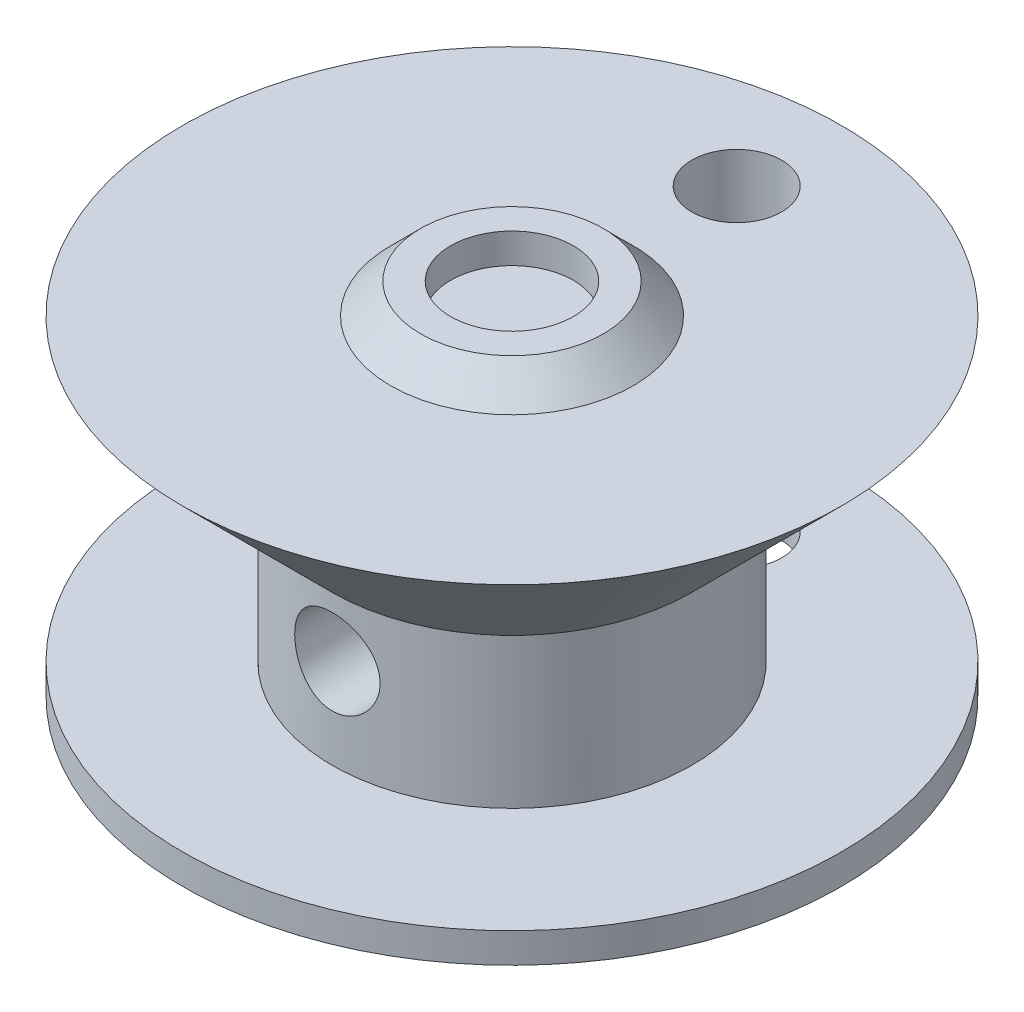
ISO-10303-21;
HEADER;
FILE_DESCRIPTION(('STEP AP214'),'2;1');
FILE_NAME('part.step','',(''),(''),'','','');
FILE_SCHEMA(('AUTOMOTIVE_DESIGN { 1 0 10303 214 1 1 1 1 }'));
ENDSEC;
DATA;
#1=APPLICATION_CONTEXT('core data for automotive mechanical design processes');
#2=APPLICATION_PROTOCOL_DEFINITION('international standard','automotive_design',2000,#1);
#3=PRODUCT_CONTEXT('',#1,'mechanical');
#4=PRODUCT('Part','Part','',(#3));
#5=PRODUCT_RELATED_PRODUCT_CATEGORY('part','',(#4));
#6=PRODUCT_DEFINITION_FORMATION('','',#4);
#7=PRODUCT_DEFINITION_CONTEXT('part definition',#1,'design');
#8=PRODUCT_DEFINITION('design','',#6,#7);
#9=PRODUCT_DEFINITION_SHAPE('','',#8);
#10=(LENGTH_UNIT() NAMED_UNIT(*) SI_UNIT(.MILLI.,.METRE.));
#11=(NAMED_UNIT(*) PLANE_ANGLE_UNIT() SI_UNIT($,.RADIAN.));
#12=(NAMED_UNIT(*) SI_UNIT($,.STERADIAN.) SOLID_ANGLE_UNIT());
#13=UNCERTAINTY_MEASURE_WITH_UNIT(LENGTH_MEASURE(1.E-05),#10,'distance_accuracy_value','');
#14=(GEOMETRIC_REPRESENTATION_CONTEXT(3) GLOBAL_UNCERTAINTY_ASSIGNED_CONTEXT((#13)) GLOBAL_UNIT_ASSIGNED_CONTEXT((#10,
#11,#12)) REPRESENTATION_CONTEXT('',''));
#15=CARTESIAN_POINT('',(0.,0.,0.));
#16=DIRECTION('',(0.,0.,1.));
#17=DIRECTION('',(1.,0.,0.));
#18=AXIS2_PLACEMENT_3D('',#15,#16,#17);
#19=CARTESIAN_POINT('',(0.,-6.,-7.5));
#20=DIRECTION('',(0.,1.,0.));
#21=DIRECTION('',(0.,0.,1.));
#22=AXIS2_PLACEMENT_3D('',#19,#20,#21);
#23=CYLINDRICAL_SURFACE('',#22,1.5);
#24=CARTESIAN_POINT('',(-1.26870488081761,2.39664434459369,-8.30024241663984));
#25=CARTESIAN_POINT('',(-1.32275027709685,2.32010996980889,-8.21456014107574));
#26=CARTESIAN_POINT('',(-1.36661427123205,2.23977946235469,-8.12580957644183));
#27=CARTESIAN_POINT('',(-1.43556861508778,2.07402530976454,-7.94553128783668));
#28=CARTESIAN_POINT('',(-1.46059999942973,1.98858656453833,-7.85399576719215));
#29=CARTESIAN_POINT('',(-1.4942810386583,1.80861159078597,-7.66438540690111));
#30=CARTESIAN_POINT('',(-1.50167214520486,1.71385565336773,-7.56629794717566));
#31=CARTESIAN_POINT('',(-1.49769646010133,1.52273200649526,-7.3721555025522));
#32=CARTESIAN_POINT('',(-1.48632198870708,1.42636365314342,-7.27610136607951));
#33=CARTESIAN_POINT('',(-1.44136326275431,1.21433888128269,-7.06889285227441));
#34=CARTESIAN_POINT('',(-1.40379527360432,1.09867605065692,-6.95855631309214));
#35=CARTESIAN_POINT('',(-1.32777047678987,0.928079019111489,-6.79966708387336));
#36=CARTESIAN_POINT('',(-1.29914550908919,0.871689688668904,-6.74780083952307));
#37=CARTESIAN_POINT('',(-1.23509860279238,0.760449514609011,-6.64670646867279));
#38=CARTESIAN_POINT('',(-1.19968071728378,0.705597775823251,-6.59747679132385));
#39=CARTESIAN_POINT('',(-1.11314269170065,0.586396158386071,-6.49175541165681));
#40=CARTESIAN_POINT('',(-1.06028236538606,0.522602721524751,-6.4360401296291));
#41=CARTESIAN_POINT('',(-0.943097883099596,0.400585750642469,-6.3309198778082));
#42=CARTESIAN_POINT('',(-0.878793020079255,0.342353092367533,-6.28150452468661));
#43=CARTESIAN_POINT('',(-0.756500471273981,0.249061398963522,-6.20327962694322));
#44=CARTESIAN_POINT('',(-0.701365247613399,0.21195371302962,-6.17248189479857));
#45=CARTESIAN_POINT('',(-0.584257625424888,0.14454205744799,-6.11695102903519));
#46=CARTESIAN_POINT('',(-0.522295903408611,0.114227682326576,-6.09220861491444));
#47=CARTESIAN_POINT('',(-0.406177715874168,0.06845167262171,-6.05504634401468));
#48=CARTESIAN_POINT('',(-0.353219440265775,0.0511968245781562,-6.0411197832836));
#49=CARTESIAN_POINT('',(-0.244353603841998,0.023716775961572,-6.01899816561024));
#50=CARTESIAN_POINT('',(-0.188448958504837,0.0134847617639953,-6.01079755316085));
#51=CARTESIAN_POINT('',(-0.0748651752631133,0.000979092118055976,-6.00078050222282));
#52=CARTESIAN_POINT('',(-0.0171782724982473,-0.00125257022391238,-5.99899775028552));
#53=CARTESIAN_POINT('',(0.0977377785373772,0.00260478651116861,-6.00208408371304));
#54=CARTESIAN_POINT('',(0.154966861760674,0.00869496756273081,-6.00695409799999));
#55=CARTESIAN_POINT('',(0.26289956448138,0.0278017441553649,-6.02228762699205));
#56=CARTESIAN_POINT('',(0.313769997322337,0.0402620240704971,-6.03230215641292));
#57=CARTESIAN_POINT('',(0.412591119335263,0.0708006987864238,-6.05695918614998));
#58=CARTESIAN_POINT('',(0.460540538205375,0.08888151730162,-6.07160368306852));
#59=CARTESIAN_POINT('',(0.576183603502632,0.139841139847716,-6.11311502864666));
#60=CARTESIAN_POINT('',(0.641730480997538,0.175595046870602,-6.14242920835007));
#61=CARTESIAN_POINT('',(0.764696200336752,0.254329872416753,-6.20767190625326));
#62=CARTESIAN_POINT('',(0.822093248199737,0.297329520653736,-6.24361758984829));
#63=CARTESIAN_POINT('',(0.955239472676362,0.410500989413759,-6.33933204884527));
#64=CARTESIAN_POINT('',(1.02622908443822,0.483674370238583,-6.40215227306974));
#65=CARTESIAN_POINT('',(1.15248143214062,0.636157472557447,-6.53551397281261));
#66=CARTESIAN_POINT('',(1.20771609827644,0.715477830113603,-6.60606892321954));
#67=CARTESIAN_POINT('',(1.32066703459271,0.906218200688929,-6.77892475952415));
#68=CARTESIAN_POINT('',(1.372338368965,1.01906030687446,-6.88362122892944));
#69=CARTESIAN_POINT('',(1.45028301900606,1.24669745037886,-7.10010691361249));
#70=CARTESIAN_POINT('',(1.47653225675623,1.36149423453782,-7.21190274632635));
#71=CARTESIAN_POINT('',(1.50329724119972,1.59113078264449,-7.44079704281348));
#72=CARTESIAN_POINT('',(1.50355618496891,1.70595976594491,-7.55793698295949));
#73=CARTESIAN_POINT('',(1.47585473872373,1.93137178768559,-7.79293428458994));
#74=CARTESIAN_POINT('',(1.44794113029228,2.04196154950744,-7.9107901347864));
#75=CARTESIAN_POINT('',(1.37398292405552,2.22354892317547,-8.10807229801832));
#76=CARTESIAN_POINT('',(1.33573647582947,2.29658704262582,-8.1885606141519));
#77=CARTESIAN_POINT('',(1.24267891629587,2.43680728048154,-8.34498890265466));
#78=CARTESIAN_POINT('',(1.18789118773595,2.50399749387767,-8.42093511534804));
#79=CARTESIAN_POINT('',(1.0749244800556,2.61599719997671,-8.54886595865352));
#80=CARTESIAN_POINT('',(1.02018847703524,2.6624665025473,-8.60243065473446));
#81=CARTESIAN_POINT('',(0.900006044458406,2.7487046523251,-8.70253204434571));
#82=CARTESIAN_POINT('',(0.834572677964978,2.78848155320884,-8.74907717816343));
#83=CARTESIAN_POINT('',(0.706264628113124,2.85304045247604,-8.82503151356365));
#84=CARTESIAN_POINT('',(0.645037687925225,2.87923237122943,-8.85601689345599));
#85=CARTESIAN_POINT('',(0.516687085002821,2.92464488396731,-8.90991795054105));
#86=CARTESIAN_POINT('',(0.449566313374306,2.94386887246678,-8.93283755691817));
#87=CARTESIAN_POINT('',(0.310589727379187,2.97435897068271,-8.96925874250693));
#88=CARTESIAN_POINT('',(0.238707761110163,2.98557631157473,-8.98270259842404));
#89=CARTESIAN_POINT('',(0.0929264122279981,2.99909503895603,-8.99891085464588));
#90=CARTESIAN_POINT('',(0.0190279881612743,3.00140058989523,-9.00168024309219));
#91=CARTESIAN_POINT('',(-0.120436862446868,2.99717846191059,-8.99661465715342));
#92=CARTESIAN_POINT('',(-0.186073694250371,2.99154073003509,-8.98984805460496));
#93=CARTESIAN_POINT('',(-0.314933280986465,2.97331621794359,-8.968021450791));
#94=CARTESIAN_POINT('',(-0.378156286918461,2.96073016235814,-8.95296231434219));
#95=CARTESIAN_POINT('',(-0.501202552691298,2.92912231987033,-8.91526508112846));
#96=CARTESIAN_POINT('',(-0.5609917860548,2.91004596042124,-8.89256273532595));
#97=CARTESIAN_POINT('',(-0.675543082484826,2.86632287250873,-8.84074689416931));
#98=CARTESIAN_POINT('',(-0.730301092470028,2.84167170744244,-8.81162829303646));
#99=CARTESIAN_POINT('',(-0.854113962432759,2.77728270448439,-8.73595339437538));
#100=CARTESIAN_POINT('',(-0.920583037277607,2.73538673742685,-8.6869949785194));
#101=CARTESIAN_POINT('',(-1.04205317521811,2.64471695153169,-8.58193849640474));
#102=CARTESIAN_POINT('',(-1.09704935890166,2.59594022103301,-8.52583740864048));
#103=CARTESIAN_POINT('',(-1.19187910226939,2.49729512770011,-8.41345191717882));
#104=CARTESIAN_POINT('',(-1.23256794247262,2.44781832375337,-8.35753305233655));
#105=CARTESIAN_POINT('',(-1.26870488081761,2.39664434459369,-8.30024241663984));
#106=B_SPLINE_CURVE_WITH_KNOTS('',3,(#24,#25,#26,#27,#28,#29,#30,#31,#32,#33,#34,#35,#36,#37,
#38,#39,#40,#41,#42,#43,#44,#45,#46,#47,#48,#49,#50,#51,#52,#53,#54,#55,#56,#57,#58,#59,#60,#61,
#62,#63,#64,#65,#66,#67,#68,#69,#70,#71,#72,#73,#74,#75,#76,#77,#78,#79,#80,#81,#82,#83,#84,#85,
#86,#87,#88,#89,#90,#91,#92,#93,#94,#95,#96,#97,#98,#99,#100,#101,#102,#103,#104,#105),
.UNSPECIFIED.,.T.,.F.,(4,2,2,2,2,2,2,2,2,2,2,2,2,2,2,2,2,2,2,2,2,2,2,2,2,2,2,2,2,2,2,2,2,2,2,2,
2,2,2,2,4),(0.,0.380592259301111,0.762371259474062,1.17066679694771,1.57912946932966,
2.06920967256334,2.3143079758544,2.55926049029338,2.85795509268234,3.15615085112281,
3.37520986109037,3.59393100423957,3.76548645441234,3.93687522357175,4.10916229002464,
4.28147341528623,4.44080457574636,4.60020453925544,4.8394823257887,5.07938839242926,
5.4366651215128,5.79457447259401,6.27919972264891,6.76428352610845,7.25415984166957,
7.74322403536122,8.08772712493193,8.43174548724646,8.69951647636424,8.96696288698869,
9.18641867477447,9.40576740775859,9.62644105837053,9.84701157644085,10.0447423446333,
10.2424524956668,10.4418679173757,10.6414426020434,10.9176638754004,11.1940023870322,
11.4484817683634),.UNSPECIFIED.);
#107=CARTESIAN_POINT('',(0.,0.,-6.));
#108=VERTEX_POINT('',#107);
#109=EDGE_CURVE('E214',#108,#108,#106,.T.);
#110=ORIENTED_EDGE('',*,*,#109,.F.);
#111=EDGE_LOOP('',(#110));
#112=FACE_BOUND('',#111,.T.);
#113=CARTESIAN_POINT('',(0.,5.,-7.5));
#114=DIRECTION('',(0.,1.,0.));
#115=DIRECTION('',(0.,0.,1.));
#116=AXIS2_PLACEMENT_3D('',#113,#114,#115);
#117=CIRCLE('',#116,1.5);
#118=CARTESIAN_POINT('',(0.,5.,-6.));
#119=VERTEX_POINT('',#118);
#120=EDGE_CURVE('E140',#119,#119,#117,.F.);
#121=ORIENTED_EDGE('',*,*,#120,.F.);
#122=EDGE_LOOP('',(#121));
#123=FACE_BOUND('',#122,.T.);
#124=ADVANCED_FACE('F44',(#112,#123),#23,.F.);
#125=CARTESIAN_POINT('',(0.,5.,0.));
#126=DIRECTION('',(0.,1.,0.));
#127=DIRECTION('',(0.,0.,1.));
#128=AXIS2_PLACEMENT_3D('',#125,#126,#127);
#129=CONICAL_SURFACE('',#128,11.,0.785398163397443);
#130=CARTESIAN_POINT('',(0.,0.,0.));
#131=DIRECTION('',(0.,-1.,0.));
#132=DIRECTION('',(0.,0.,-1.));
#133=AXIS2_PLACEMENT_3D('',#130,#131,#132);
#134=CIRCLE('',#133,6.);
#135=EDGE_CURVE('E253',#108,#108,#134,.T.);
#136=ORIENTED_EDGE('',*,*,#135,.F.);
#137=ORIENTED_EDGE('',*,*,#109,.T.);
#138=EDGE_LOOP('',(#136,#137));
#139=FACE_BOUND('',#138,.T.);
#140=CARTESIAN_POINT('',(0.,5.,0.));
#141=DIRECTION('',(0.,1.,0.));
#142=DIRECTION('',(0.,0.,1.));
#143=AXIS2_PLACEMENT_3D('',#140,#141,#142);
#144=CIRCLE('',#143,11.);
#145=CARTESIAN_POINT('',(0.,5.,11.));
#146=VERTEX_POINT('',#145);
#147=EDGE_CURVE('E137',#146,#146,#144,.T.);
#148=ORIENTED_EDGE('',*,*,#147,.F.);
#149=EDGE_LOOP('',(#148));
#150=FACE_BOUND('',#149,.T.);
#151=ADVANCED_FACE('F192',(#139,#150),#129,.T.);
#152=CARTESIAN_POINT('',(0.,0.,0.));
#153=DIRECTION('',(0.,-1.,0.));
#154=DIRECTION('',(0.,0.,-1.));
#155=AXIS2_PLACEMENT_3D('',#152,#153,#154);
#156=CYLINDRICAL_SURFACE('',#155,6.);
#157=CARTESIAN_POINT('',(-1.425,-2.,5.82832523114488));
#158=CARTESIAN_POINT('',(-1.42499754957619,-1.92117794111468,5.82832679456273));
#159=CARTESIAN_POINT('',(-1.4184378215098,-1.8423278408162,5.8299416549799));
#160=CARTESIAN_POINT('',(-1.39240856638387,-1.68688283008329,5.83621206316854));
#161=CARTESIAN_POINT('',(-1.37293077688578,-1.61028939578861,5.84086955699068));
#162=CARTESIAN_POINT('',(-1.3217239026565,-1.46162862093966,5.85266866593076));
#163=CARTESIAN_POINT('',(-1.29000964313047,-1.38955592561644,5.85980727399827));
#164=CARTESIAN_POINT('',(-1.2152741852674,-1.25174876665406,5.87576058358233));
#165=CARTESIAN_POINT('',(-1.1722527981629,-1.18601440885566,5.8845753130803));
#166=CARTESIAN_POINT('',(-1.07521152025432,-1.06144284368174,5.90308368584141));
#167=CARTESIAN_POINT('',(-1.02100856102342,-1.00275013738444,5.91279023612396));
#168=CARTESIAN_POINT('',(-0.903537466038936,-0.895197867578534,5.93187618342717));
#169=CARTESIAN_POINT('',(-0.840268545152597,-0.846339156598283,5.9412555520256));
#170=CARTESIAN_POINT('',(-0.705480224711474,-0.759258685312054,5.95877223244116));
#171=CARTESIAN_POINT('',(-0.633867502858192,-0.72117765815591,5.96689253595175));
#172=CARTESIAN_POINT('',(-0.485032922332116,-0.657646682120868,5.98082949973903));
#173=CARTESIAN_POINT('',(-0.40781180994908,-0.632195056207136,5.9866464658509));
#174=CARTESIAN_POINT('',(-0.251457394902446,-0.595104755455636,5.99523011087759));
#175=CARTESIAN_POINT('',(-0.172385244024105,-0.583221017594807,5.99805084031474));
#176=CARTESIAN_POINT('',(-0.0133227060721131,-0.572835846943138,6.00051209689845));
#177=CARTESIAN_POINT('',(0.066667556540959,-0.574332621177976,6.00015305013169));
#178=CARTESIAN_POINT('',(0.223600311847056,-0.590487129989937,5.99633589030348));
#179=CARTESIAN_POINT('',(0.300571757474747,-0.60488050469724,5.99294002981346));
#180=CARTESIAN_POINT('',(0.450974185407286,-0.645996235816392,5.98350262636849));
#181=CARTESIAN_POINT('',(0.524404989940588,-0.672719210572903,5.97746095072343));
#182=CARTESIAN_POINT('',(0.666353632274086,-0.737957646266642,5.96331349407922));
#183=CARTESIAN_POINT('',(0.7348253277587,-0.776569709910809,5.95519089927642));
#184=CARTESIAN_POINT('',(0.864411622860792,-0.864417535474857,5.93776673030385));
#185=CARTESIAN_POINT('',(0.925525053314482,-0.913654982213596,5.92846496925563));
#186=CARTESIAN_POINT('',(1.04023513517472,-1.02278244311827,5.90943134397237));
#187=CARTESIAN_POINT('',(1.0936112232232,-1.08290367000971,5.89969452491111));
#188=CARTESIAN_POINT('',(1.18956960142804,-1.21134566768674,5.88109854367104));
#189=CARTESIAN_POINT('',(1.23215148268538,-1.27966674894938,5.87223941474805));
#190=CARTESIAN_POINT('',(1.30543564121244,-1.42296989418145,5.85638589540492));
#191=CARTESIAN_POINT('',(1.33608959815281,-1.4979775692796,5.84939912478785));
#192=CARTESIAN_POINT('',(1.38428698892714,-1.65228645669022,5.8381819440304));
#193=CARTESIAN_POINT('',(1.40183292150916,-1.73158684760096,5.83395100857215));
#194=CARTESIAN_POINT('',(1.42296022511067,-1.89019707641701,5.82883355152234));
#195=CARTESIAN_POINT('',(1.42686565223275,-1.96946129707896,5.82786943727281));
#196=CARTESIAN_POINT('',(1.42148419611726,-2.12750850010429,5.82918435723626));
#197=CARTESIAN_POINT('',(1.41219839709507,-2.20629152148399,5.8314631249098));
#198=CARTESIAN_POINT('',(1.38098102911739,-2.35996807984924,5.83893313640274));
#199=CARTESIAN_POINT('',(1.35923386623355,-2.43490133676671,5.84408188006119));
#200=CARTESIAN_POINT('',(1.30391354344055,-2.58005968451581,5.85667219311371));
#201=CARTESIAN_POINT('',(1.27033909049535,-2.65028425956418,5.86411401319062));
#202=CARTESIAN_POINT('',(1.19162428403317,-2.78541705838874,5.8806182798807));
#203=CARTESIAN_POINT('',(1.14628774384152,-2.85020768330397,5.88970734012212));
#204=CARTESIAN_POINT('',(1.04558730851077,-2.97138056747636,5.90841470344032));
#205=CARTESIAN_POINT('',(0.990221933262647,-3.02776158335589,5.91803308449101));
#206=CARTESIAN_POINT('',(0.869556752398671,-3.13180463928887,5.93697533960111));
#207=CARTESIAN_POINT('',(0.804062689699717,-3.17924382919634,5.94628783859659));
#208=CARTESIAN_POINT('',(0.665848352025764,-3.26244852029105,5.96334530149905));
#209=CARTESIAN_POINT('',(0.593128441744467,-3.29821461023804,5.9710903444568));
#210=CARTESIAN_POINT('',(0.443013753404265,-3.35676367389571,5.98409303799143));
#211=CARTESIAN_POINT('',(0.365655444630001,-3.3796361755934,5.98936779679556));
#212=CARTESIAN_POINT('',(0.208052824060789,-3.41202261861977,5.99691014196913));
#213=CARTESIAN_POINT('',(0.12780901409213,-3.42153887136055,5.99917824866144));
#214=CARTESIAN_POINT('',(-0.0311844096307587,-3.42682337649029,6.00043288774065));
#215=CARTESIAN_POINT('',(-0.109922594873196,-3.42292203304504,5.99949828785367));
#216=CARTESIAN_POINT('',(-0.265587005387246,-3.4022315097075,5.99462496231744));
#217=CARTESIAN_POINT('',(-0.342513275190985,-3.38544264689798,5.99068631057949));
#218=CARTESIAN_POINT('',(-0.492061523146552,-3.33962340972911,5.98025705107414));
#219=CARTESIAN_POINT('',(-0.564701031253576,-3.31064749767687,5.9737778055015));
#220=CARTESIAN_POINT('',(-0.704127266421656,-3.24132717920489,5.95895343063428));
#221=CARTESIAN_POINT('',(-0.770913320694782,-3.20098146819677,5.95060808724345));
#222=CARTESIAN_POINT('',(-0.898322696426091,-3.10903022563571,5.93272702059266));
#223=CARTESIAN_POINT('',(-0.958778626336288,-3.05719704033408,5.92316919456891));
#224=CARTESIAN_POINT('',(-1.07024680803671,-2.94419142450456,5.90404754439496));
#225=CARTESIAN_POINT('',(-1.12125671726887,-2.88301668417025,5.89448371934548));
#226=CARTESIAN_POINT('',(-1.2132001891787,-2.75185721078929,5.87625592299568));
#227=CARTESIAN_POINT('',(-1.25395483674395,-2.68174448019415,5.86760927573776));
#228=CARTESIAN_POINT('',(-1.3230374514788,-2.53546986406481,5.85242104719916));
#229=CARTESIAN_POINT('',(-1.35137508425611,-2.4593127383286,5.84587782963499));
#230=CARTESIAN_POINT('',(-1.39024734307959,-2.31933012771111,5.83673875618309));
#231=CARTESIAN_POINT('',(-1.40325264531731,-2.25621427961283,5.83360622937949));
#232=CARTESIAN_POINT('',(-1.42062967935164,-2.12873846619256,5.82939889873367));
#233=CARTESIAN_POINT('',(-1.42500200140447,-2.06437858623169,5.82832395421006));
#234=CARTESIAN_POINT('',(-1.425,-2.,5.82832523114488));
#235=B_SPLINE_CURVE_WITH_KNOTS('',3,(#157,#158,#159,#160,#161,#162,#163,#164,#165,#166,#167,
#168,#169,#170,#171,#172,#173,#174,#175,#176,#177,#178,#179,#180,#181,#182,#183,#184,#185,#186,
#187,#188,#189,#190,#191,#192,#193,#194,#195,#196,#197,#198,#199,#200,#201,#202,#203,#204,#205,
#206,#207,#208,#209,#210,#211,#212,#213,#214,#215,#216,#217,#218,#219,#220,#221,#222,#223,#224,
#225,#226,#227,#228,#229,#230,#231,#232,#233,#234),.UNSPECIFIED.,.T.,.F.,(4,2,2,2,2,2,2,2,2,2,2,
2,2,2,2,2,2,2,2,2,2,2,2,2,2,2,2,2,2,2,2,2,2,2,2,2,2,2,4),(0.,0.236229964319735,
0.472611168075709,0.708706876822911,0.94480652733293,1.18513185469304,1.42547800736211,
1.66883126540121,1.91215220035797,2.15100506917129,2.38982593243524,2.62386058864489,
2.85790698325742,3.09390763721001,3.32994574024992,3.57176046435215,3.81358434735197,
4.05637791239286,4.2991251825196,4.5360647730778,4.77298489018577,5.00648635867051,
5.24001336297664,5.47771857743411,5.71545890232203,5.95850886172442,6.20154656044608,
6.44287523147116,6.68416213337229,6.91955039892646,7.15493287320522,7.38927444719503,
7.62364292085647,7.86315428456029,8.1027249663727,8.34622345334994,8.58953205893179,
8.78248808248773,8.97543091275044),.UNSPECIFIED.);
#236=CARTESIAN_POINT('',(-1.425,-2.,5.82832523114488));
#237=VERTEX_POINT('',#236);
#238=EDGE_CURVE('E141',#237,#237,#235,.T.);
#239=ORIENTED_EDGE('',*,*,#238,.T.);
#240=EDGE_LOOP('',(#239));
#241=FACE_BOUND('',#240,.T.);
#242=ORIENTED_EDGE('',*,*,#135,.T.);
#243=EDGE_LOOP('',(#242));
#244=FACE_BOUND('',#243,.T.);
#245=CARTESIAN_POINT('',(0.,-5.,0.));
#246=DIRECTION('',(0.,-1.,0.));
#247=DIRECTION('',(0.,0.,-1.));
#248=AXIS2_PLACEMENT_3D('',#245,#246,#247);
#249=CIRCLE('',#248,6.);
#250=CARTESIAN_POINT('',(0.,-5.,-6.));
#251=VERTEX_POINT('',#250);
#252=EDGE_CURVE('E262',#251,#251,#249,.T.);
#253=ORIENTED_EDGE('',*,*,#252,.F.);
#254=EDGE_LOOP('',(#253));
#255=FACE_BOUND('',#254,.T.);
#256=ADVANCED_FACE('F150',(#241,#244,#255),#156,.T.);
#257=CARTESIAN_POINT('',(0.,-5.,0.));
#258=DIRECTION('',(0.,1.,0.));
#259=DIRECTION('',(0.,0.,1.));
#260=AXIS2_PLACEMENT_3D('',#257,#258,#259);
#261=PLANE('',#260);
#262=ORIENTED_EDGE('',*,*,#252,.T.);
#263=CARTESIAN_POINT('',(0.,-5.,-7.5));
#264=DIRECTION('',(0.,1.,0.));
#265=DIRECTION('',(0.,0.,1.));
#266=AXIS2_PLACEMENT_3D('',#263,#264,#265);
#267=CIRCLE('',#266,1.5);
#268=EDGE_CURVE('E210',#251,#251,#267,.T.);
#269=ORIENTED_EDGE('',*,*,#268,.F.);
#270=EDGE_LOOP('',(#262,#269));
#271=FACE_BOUND('',#270,.T.);
#272=CARTESIAN_POINT('',(0.,-5.,0.));
#273=DIRECTION('',(0.,-1.,0.));
#274=DIRECTION('',(0.,0.,-1.));
#275=AXIS2_PLACEMENT_3D('',#272,#273,#274);
#276=CIRCLE('',#275,11.);
#277=CARTESIAN_POINT('',(0.,-5.,-11.));
#278=VERTEX_POINT('',#277);
#279=EDGE_CURVE('E265',#278,#278,#276,.T.);
#280=ORIENTED_EDGE('',*,*,#279,.F.);
#281=EDGE_LOOP('',(#280));
#282=FACE_BOUND('',#281,.T.);
#283=ADVANCED_FACE('F283',(#271,#282),#261,.T.);
#284=CARTESIAN_POINT('',(0.,0.,0.));
#285=DIRECTION('',(0.,-1.,0.));
#286=DIRECTION('',(0.,0.,-1.));
#287=AXIS2_PLACEMENT_3D('',#284,#285,#286);
#288=CYLINDRICAL_SURFACE('',#287,11.);
#289=CARTESIAN_POINT('',(0.,-6.,0.));
#290=DIRECTION('',(0.,-1.,0.));
#291=DIRECTION('',(0.,0.,-1.));
#292=AXIS2_PLACEMENT_3D('',#289,#290,#291);
#293=CIRCLE('',#292,11.);
#294=CARTESIAN_POINT('',(0.,-6.,-11.));
#295=VERTEX_POINT('',#294);
#296=EDGE_CURVE('E268',#295,#295,#293,.T.);
#297=ORIENTED_EDGE('',*,*,#296,.F.);
#298=EDGE_LOOP('',(#297));
#299=FACE_BOUND('',#298,.T.);
#300=ORIENTED_EDGE('',*,*,#279,.T.);
#301=EDGE_LOOP('',(#300));
#302=FACE_BOUND('',#301,.T.);
#303=ADVANCED_FACE('F205',(#299,#302),#288,.T.);
#304=CARTESIAN_POINT('',(0.,-6.,0.));
#305=DIRECTION('',(0.,-1.,0.));
#306=DIRECTION('',(0.,0.,-1.));
#307=AXIS2_PLACEMENT_3D('',#304,#305,#306);
#308=PLANE('',#307);
#309=CARTESIAN_POINT('',(0.,-6.,0.));
#310=DIRECTION('',(0.,-1.,0.));
#311=DIRECTION('',(0.,0.,-1.));
#312=AXIS2_PLACEMENT_3D('',#309,#310,#311);
#313=CIRCLE('',#312,2.20000000000011);
#314=CARTESIAN_POINT('',(-1.39642400437706,-6.,1.7));
#315=VERTEX_POINT('',#314);
#316=CARTESIAN_POINT('',(1.39642400437706,-6.,1.7));
#317=VERTEX_POINT('',#316);
#318=EDGE_CURVE('E68',#315,#317,#313,.T.);
#319=ORIENTED_EDGE('',*,*,#318,.F.);
#320=DIRECTION('',(-1.,0.,0.));
#321=VECTOR('',#320,1.);
#322=CARTESIAN_POINT('',(1.39642400437706,-6.,1.7));
#323=LINE('',#322,#321);
#324=EDGE_CURVE('E121',#317,#315,#323,.T.);
#325=ORIENTED_EDGE('',*,*,#324,.F.);
#326=EDGE_LOOP('',(#319,#325));
#327=FACE_BOUND('',#326,.T.);
#328=CARTESIAN_POINT('',(0.,-6.,-7.5));
#329=DIRECTION('',(0.,1.,0.));
#330=DIRECTION('',(0.,0.,1.));
#331=AXIS2_PLACEMENT_3D('',#328,#329,#330);
#332=CIRCLE('',#331,1.5);
#333=CARTESIAN_POINT('',(0.,-6.,-6.));
#334=VERTEX_POINT('',#333);
#335=EDGE_CURVE('E148',#334,#334,#332,.T.);
#336=ORIENTED_EDGE('',*,*,#335,.T.);
#337=EDGE_LOOP('',(#336));
#338=FACE_BOUND('',#337,.T.);
#339=ORIENTED_EDGE('',*,*,#296,.T.);
#340=EDGE_LOOP('',(#339));
#341=FACE_BOUND('',#340,.T.);
#342=ADVANCED_FACE('F200',(#327,#338,#341),#308,.T.);
#343=ORIENTED_EDGE('',*,*,#268,.T.);
#344=EDGE_LOOP('',(#343));
#345=FACE_BOUND('',#344,.T.);
#346=ORIENTED_EDGE('',*,*,#335,.F.);
#347=EDGE_LOOP('',(#346));
#348=FACE_BOUND('',#347,.T.);
#349=ADVANCED_FACE('F160',(#345,#348),#23,.F.);
#350=CARTESIAN_POINT('',(0.,-2.,11.));
#351=DIRECTION('',(0.,0.,-1.));
#352=DIRECTION('',(-1.,0.,0.));
#353=AXIS2_PLACEMENT_3D('',#350,#351,#352);
#354=CYLINDRICAL_SURFACE('',#353,1.425);
#355=CARTESIAN_POINT('',(1.39642400437706,-1.71605458271081,1.7));
#356=CARTESIAN_POINT('',(1.40265959096074,-1.74671968061779,1.69487445606028));
#357=CARTESIAN_POINT('',(1.40790573112252,-1.7777017221564,1.6905118121211));
#358=CARTESIAN_POINT('',(1.41635676145593,-1.84014467596288,1.68343859870529));
#359=CARTESIAN_POINT('',(1.41956057969113,-1.87160583084422,1.68072889682661));
#360=CARTESIAN_POINT('',(1.42590860019081,-1.9649845895556,1.67535869472703));
#361=CARTESIAN_POINT('',(1.42607769742589,-2.02731291595108,1.67521329275141));
#362=CARTESIAN_POINT('',(1.42016397004416,-2.12182775275974,1.68021885464184));
#363=CARTESIAN_POINT('',(1.41698762602324,-2.15438718347135,1.68290804682718));
#364=CARTESIAN_POINT('',(1.40839439452664,-2.21939957952166,1.69010490874541));
#365=CARTESIAN_POINT('',(1.40295173075397,-2.25184684345843,1.69463348390683));
#366=CARTESIAN_POINT('',(1.39642400437706,-2.28394541728918,1.7));
#367=B_SPLINE_CURVE_WITH_KNOTS('',3,(#355,#356,#357,#358,#359,#360,#361,#362,#363,#364,#365,
#366),.UNSPECIFIED.,.F.,.F.,(4,2,2,2,2,4),(0.,0.0950755676313671,0.190200995782682,
0.376112833057411,0.474480392164904,0.573998704055529),.UNSPECIFIED.);
#368=CARTESIAN_POINT('',(1.39642400437706,-1.7160545827108,1.7));
#369=VERTEX_POINT('',#368);
#370=CARTESIAN_POINT('',(1.39642400437706,-2.28394541728919,1.7));
#371=VERTEX_POINT('',#370);
#372=EDGE_CURVE('E49',#369,#371,#367,.T.);
#373=ORIENTED_EDGE('',*,*,#372,.T.);
#374=CARTESIAN_POINT('',(0.,-2.,1.7));
#375=DIRECTION('',(0.,0.,1.));
#376=DIRECTION('',(1.,0.,0.));
#377=AXIS2_PLACEMENT_3D('',#374,#375,#376);
#378=CIRCLE('',#377,1.425);
#379=CARTESIAN_POINT('',(-1.39642400437706,-2.28394541728918,1.7));
#380=VERTEX_POINT('',#379);
#381=EDGE_CURVE('E11',#371,#380,#378,.F.);
#382=ORIENTED_EDGE('',*,*,#381,.T.);
#383=CARTESIAN_POINT('',(-1.39642400437706,-2.28394541728919,1.7));
#384=CARTESIAN_POINT('',(-1.40265959096074,-2.2532803193822,1.69487445606028));
#385=CARTESIAN_POINT('',(-1.40790573112252,-2.22229827784359,1.6905118121211));
#386=CARTESIAN_POINT('',(-1.41635676145593,-2.15985532403711,1.68343859870529));
#387=CARTESIAN_POINT('',(-1.41956057969113,-2.12839416915577,1.68072889682661));
#388=CARTESIAN_POINT('',(-1.42590860019081,-2.0350154104444,1.67535869472703));
#389=CARTESIAN_POINT('',(-1.42607769742589,-1.97268708404891,1.67521329275141));
#390=CARTESIAN_POINT('',(-1.42016397004416,-1.87817224724026,1.68021885464184));
#391=CARTESIAN_POINT('',(-1.41698762602324,-1.84561281652864,1.68290804682718));
#392=CARTESIAN_POINT('',(-1.40839439452664,-1.78060042047833,1.69010490874541));
#393=CARTESIAN_POINT('',(-1.40295173075397,-1.74815315654156,1.69463348390683));
#394=CARTESIAN_POINT('',(-1.39642400437706,-1.7160545827108,1.7));
#395=B_SPLINE_CURVE_WITH_KNOTS('',3,(#383,#384,#385,#386,#387,#388,#389,#390,#391,#392,#393,
#394),.UNSPECIFIED.,.F.,.F.,(4,2,2,2,2,4),(0.,0.0950755676313672,0.190200995782681,
0.376112833057411,0.474480392164906,0.573998704055534),.UNSPECIFIED.);
#396=CARTESIAN_POINT('',(-1.39642400437706,-1.71605458271081,1.7));
#397=VERTEX_POINT('',#396);
#398=EDGE_CURVE('E166',#380,#397,#395,.T.);
#399=ORIENTED_EDGE('',*,*,#398,.T.);
#400=EDGE_CURVE('E61',#397,#369,#378,.F.);
#401=ORIENTED_EDGE('',*,*,#400,.T.);
#402=EDGE_LOOP('',(#373,#382,#399,#401));
#403=FACE_BOUND('',#402,.T.);
#404=ORIENTED_EDGE('',*,*,#238,.F.);
#405=EDGE_LOOP('',(#404));
#406=FACE_BOUND('',#405,.T.);
#407=ADVANCED_FACE('F154',(#403,#406),#354,.F.);
#408=CARTESIAN_POINT('',(0.,5.,0.));
#409=DIRECTION('',(0.,1.,0.));
#410=DIRECTION('',(0.,0.,1.));
#411=AXIS2_PLACEMENT_3D('',#408,#409,#410);
#412=PLANE('',#411);
#413=CARTESIAN_POINT('',(0.,5.,0.));
#414=DIRECTION('',(0.,1.,0.));
#415=DIRECTION('',(0.,0.,1.));
#416=AXIS2_PLACEMENT_3D('',#413,#414,#415);
#417=CIRCLE('',#416,4.04999999999999);
#418=CARTESIAN_POINT('',(0.,5.,4.04999999999999));
#419=VERTEX_POINT('',#418);
#420=EDGE_CURVE('E248',#419,#419,#417,.F.);
#421=ORIENTED_EDGE('',*,*,#420,.T.);
#422=EDGE_LOOP('',(#421));
#423=FACE_BOUND('',#422,.T.);
#424=ORIENTED_EDGE('',*,*,#147,.T.);
#425=EDGE_LOOP('',(#424));
#426=FACE_BOUND('',#425,.T.);
#427=ORIENTED_EDGE('',*,*,#120,.T.);
#428=EDGE_LOOP('',(#427));
#429=FACE_BOUND('',#428,.T.);
#430=ADVANCED_FACE('F159',(#423,#426,#429),#412,.T.);
#431=CARTESIAN_POINT('',(0.,5.,0.));
#432=DIRECTION('',(0.,1.,0.));
#433=DIRECTION('',(0.,0.,1.));
#434=AXIS2_PLACEMENT_3D('',#431,#432,#433);
#435=PLANE('',#434);
#436=CARTESIAN_POINT('',(0.,4.99999999999999,0.));
#437=DIRECTION('',(0.,-1.,0.));
#438=DIRECTION('',(0.,0.,-1.));
#439=AXIS2_PLACEMENT_3D('',#436,#437,#438);
#440=CIRCLE('',#439,2.05);
#441=CARTESIAN_POINT('',(0.,4.99999999999999,-2.05));
#442=VERTEX_POINT('',#441);
#443=EDGE_CURVE('E246',#442,#442,#440,.T.);
#444=ORIENTED_EDGE('',*,*,#443,.F.);
#445=EDGE_LOOP('',(#444));
#446=FACE_BOUND('',#445,.T.);
#447=ADVANCED_FACE('F236',(#446),#435,.T.);
#448=CARTESIAN_POINT('',(0.,0.,0.));
#449=DIRECTION('',(0.,-1.,0.));
#450=DIRECTION('',(0.,0.,-1.));
#451=AXIS2_PLACEMENT_3D('',#448,#449,#450);
#452=CYLINDRICAL_SURFACE('',#451,2.05);
#453=CARTESIAN_POINT('',(0.,6.,0.));
#454=DIRECTION('',(0.,-1.,0.));
#455=DIRECTION('',(0.,0.,-1.));
#456=AXIS2_PLACEMENT_3D('',#453,#454,#455);
#457=CIRCLE('',#456,2.05);
#458=CARTESIAN_POINT('',(0.,6.,-2.05));
#459=VERTEX_POINT('',#458);
#460=EDGE_CURVE('E249',#459,#459,#457,.T.);
#461=ORIENTED_EDGE('',*,*,#460,.F.);
#462=EDGE_LOOP('',(#461));
#463=FACE_BOUND('',#462,.T.);
#464=ORIENTED_EDGE('',*,*,#443,.T.);
#465=EDGE_LOOP('',(#464));
#466=FACE_BOUND('',#465,.T.);
#467=ADVANCED_FACE('F233',(#463,#466),#452,.F.);
#468=CARTESIAN_POINT('',(0.,6.,0.));
#469=DIRECTION('',(0.,1.,0.));
#470=DIRECTION('',(0.,0.,1.));
#471=AXIS2_PLACEMENT_3D('',#468,#469,#470);
#472=PLANE('',#471);
#473=ORIENTED_EDGE('',*,*,#460,.T.);
#474=EDGE_LOOP('',(#473));
#475=FACE_BOUND('',#474,.T.);
#476=CARTESIAN_POINT('',(0.,6.,0.));
#477=DIRECTION('',(0.,1.,0.));
#478=DIRECTION('',(0.,0.,1.));
#479=AXIS2_PLACEMENT_3D('',#476,#477,#478);
#480=CIRCLE('',#479,3.05);
#481=CARTESIAN_POINT('',(0.,6.,3.05));
#482=VERTEX_POINT('',#481);
#483=EDGE_CURVE('E134',#482,#482,#480,.T.);
#484=ORIENTED_EDGE('',*,*,#483,.T.);
#485=EDGE_LOOP('',(#484));
#486=FACE_BOUND('',#485,.T.);
#487=ADVANCED_FACE('F230',(#475,#486),#472,.T.);
#488=CARTESIAN_POINT('',(0.,5.99999999999999,0.));
#489=DIRECTION('',(0.,-1.,0.));
#490=DIRECTION('',(0.,0.,-1.));
#491=AXIS2_PLACEMENT_3D('',#488,#489,#490);
#492=CONICAL_SURFACE('',#491,3.05,0.785398163397444);
#493=ORIENTED_EDGE('',*,*,#420,.F.);
#494=EDGE_LOOP('',(#493));
#495=FACE_BOUND('',#494,.T.);
#496=ORIENTED_EDGE('',*,*,#483,.F.);
#497=EDGE_LOOP('',(#496));
#498=FACE_BOUND('',#497,.T.);
#499=ADVANCED_FACE('F47',(#495,#498),#492,.T.);
#500=CARTESIAN_POINT('',(0.,2.,0.));
#501=DIRECTION('',(0.,-1.,0.));
#502=DIRECTION('',(0.,0.,-1.));
#503=AXIS2_PLACEMENT_3D('',#500,#501,#502);
#504=CYLINDRICAL_SURFACE('',#503,2.20000000000011);
#505=DIRECTION('',(0.,-1.,0.));
#506=VECTOR('',#505,1.);
#507=CARTESIAN_POINT('',(1.39642400437706,2.,1.7));
#508=LINE('',#507,#506);
#509=CARTESIAN_POINT('',(1.39642400437706,2.,1.7));
#510=VERTEX_POINT('',#509);
#511=EDGE_CURVE('E76',#510,#369,#508,.T.);
#512=ORIENTED_EDGE('',*,*,#511,.F.);
#513=CARTESIAN_POINT('',(0.,2.,0.));
#514=DIRECTION('',(0.,-1.,0.));
#515=DIRECTION('',(0.,0.,-1.));
#516=AXIS2_PLACEMENT_3D('',#513,#514,#515);
#517=CIRCLE('',#516,2.20000000000011);
#518=CARTESIAN_POINT('',(-1.39642400437706,2.,1.7));
#519=VERTEX_POINT('',#518);
#520=EDGE_CURVE('E111',#519,#510,#517,.T.);
#521=ORIENTED_EDGE('',*,*,#520,.F.);
#522=DIRECTION('',(0.,-1.,0.));
#523=VECTOR('',#522,1.);
#524=CARTESIAN_POINT('',(-1.39642400437706,2.,1.7));
#525=LINE('',#524,#523);
#526=EDGE_CURVE('E124',#519,#397,#525,.T.);
#527=ORIENTED_EDGE('',*,*,#526,.T.);
#528=ORIENTED_EDGE('',*,*,#398,.F.);
#529=EDGE_CURVE('E115',#380,#315,#525,.T.);
#530=ORIENTED_EDGE('',*,*,#529,.T.);
#531=ORIENTED_EDGE('',*,*,#318,.T.);
#532=EDGE_CURVE('E116',#371,#317,#508,.T.);
#533=ORIENTED_EDGE('',*,*,#532,.F.);
#534=ORIENTED_EDGE('',*,*,#372,.F.);
#535=EDGE_LOOP('',(#512,#521,#527,#528,#530,#531,#533,#534));
#536=FACE_BOUND('',#535,.T.);
#537=ADVANCED_FACE('F109',(#536),#504,.F.);
#538=CARTESIAN_POINT('',(1.39642400437706,2.,1.7));
#539=DIRECTION('',(0.,0.,1.));
#540=DIRECTION('',(1.,0.,0.));
#541=AXIS2_PLACEMENT_3D('',#538,#539,#540);
#542=PLANE('',#541);
#543=ORIENTED_EDGE('',*,*,#532,.T.);
#544=ORIENTED_EDGE('',*,*,#324,.T.);
#545=ORIENTED_EDGE('',*,*,#529,.F.);
#546=ORIENTED_EDGE('',*,*,#381,.F.);
#547=EDGE_LOOP('',(#543,#544,#545,#546));
#548=FACE_BOUND('',#547,.T.);
#549=ADVANCED_FACE('F176',(#548),#542,.F.);
#550=ORIENTED_EDGE('',*,*,#526,.F.);
#551=DIRECTION('',(-1.,0.,0.));
#552=VECTOR('',#551,1.);
#553=CARTESIAN_POINT('',(1.39642400437706,2.,1.7));
#554=LINE('',#553,#552);
#555=EDGE_CURVE('E120',#510,#519,#554,.T.);
#556=ORIENTED_EDGE('',*,*,#555,.F.);
#557=ORIENTED_EDGE('',*,*,#511,.T.);
#558=ORIENTED_EDGE('',*,*,#400,.F.);
#559=EDGE_LOOP('',(#550,#556,#557,#558));
#560=FACE_BOUND('',#559,.T.);
#561=ADVANCED_FACE('F123',(#560),#542,.F.);
#562=CARTESIAN_POINT('',(0.,2.,0.));
#563=DIRECTION('',(0.,-1.,0.));
#564=DIRECTION('',(0.,0.,-1.));
#565=AXIS2_PLACEMENT_3D('',#562,#563,#564);
#566=PLANE('',#565);
#567=CARTESIAN_POINT('',(0.,2.,0.));
#568=DIRECTION('',(0.,-1.,0.));
#569=DIRECTION('',(0.,0.,-1.));
#570=AXIS2_PLACEMENT_3D('',#567,#568,#569);
#571=CIRCLE('',#570,2.);
#572=CARTESIAN_POINT('',(-1.32287565553229,2.,1.5));
#573=VERTEX_POINT('',#572);
#574=CARTESIAN_POINT('',(1.32287565553229,2.,1.5));
#575=VERTEX_POINT('',#574);
#576=EDGE_CURVE('E270',#573,#575,#571,.T.);
#577=ORIENTED_EDGE('',*,*,#576,.F.);
#578=DIRECTION('',(-1.,0.,0.));
#579=VECTOR('',#578,1.);
#580=CARTESIAN_POINT('',(1.32287565553229,2.,1.5));
#581=LINE('',#580,#579);
#582=EDGE_CURVE('E130',#575,#573,#581,.T.);
#583=ORIENTED_EDGE('',*,*,#582,.F.);
#584=EDGE_LOOP('',(#577,#583));
#585=FACE_BOUND('',#584,.T.);
#586=ORIENTED_EDGE('',*,*,#520,.T.);
#587=ORIENTED_EDGE('',*,*,#555,.T.);
#588=EDGE_LOOP('',(#586,#587));
#589=FACE_BOUND('',#588,.T.);
#590=ADVANCED_FACE('F119',(#585,#589),#566,.T.);
#591=CARTESIAN_POINT('',(0.,2.,0.));
#592=DIRECTION('',(0.,-1.,0.));
#593=DIRECTION('',(0.,0.,-1.));
#594=AXIS2_PLACEMENT_3D('',#591,#592,#593);
#595=CONICAL_SURFACE('',#594,2.,0.785398163397449);
#596=CARTESIAN_POINT('',(0.,4.,0.));
#597=VERTEX_POINT('',#596);
#598=VERTEX_LOOP('',#597);
#599=FACE_BOUND('',#598,.T.);
#600=ORIENTED_EDGE('',*,*,#576,.T.);
#601=CARTESIAN_POINT('',(-4.63970044588769,-0.876148093277141,1.5));
#602=CARTESIAN_POINT('',(-4.47881325269258,-0.723116108506115,1.5));
#603=CARTESIAN_POINT('',(-4.31759728700502,-0.570423740539096,1.5));
#604=CARTESIAN_POINT('',(-3.99406585436563,-0.266076927918995,1.5));
#605=CARTESIAN_POINT('',(-3.83174996685898,-0.114422930709676,1.5));
#606=CARTESIAN_POINT('',(-3.50378194562581,0.189145113098024,1.5));
#607=CARTESIAN_POINT('',(-3.338113049335,0.341041083335212,1.5));
#608=CARTESIAN_POINT('',(-3.00470362966848,0.642455267449646,1.5));
#609=CARTESIAN_POINT('',(-2.83696374044647,0.791974178618685,1.5));
#610=CARTESIAN_POINT('',(-2.53959944798954,1.05115968672581,1.5));
#611=CARTESIAN_POINT('',(-2.4106805571374,1.16163400531798,1.5));
#612=CARTESIAN_POINT('',(-2.15001582363668,1.37943282338003,1.5));
#613=CARTESIAN_POINT('',(-2.01826795860468,1.48675493018701,1.5));
#614=CARTESIAN_POINT('',(-1.8176820179745,1.64367518027169,1.5));
#615=CARTESIAN_POINT('',(-1.75039662774939,1.69525388803448,1.5));
#616=CARTESIAN_POINT('',(-1.61453083968114,1.7966714828052,1.5));
#617=CARTESIAN_POINT('',(-1.54595056612872,1.84651053550067,1.5));
#618=CARTESIAN_POINT('',(-1.40723824517629,1.94381915068901,1.5));
#619=CARTESIAN_POINT('',(-1.33710810006038,1.99129140782339,1.5));
#620=CARTESIAN_POINT('',(-1.19481820152045,2.08306841531777,1.5));
#621=CARTESIAN_POINT('',(-1.12265912924137,2.12737421143055,1.5));
#622=CARTESIAN_POINT('',(-0.994649225172697,2.20073959953086,1.5));
#623=CARTESIAN_POINT('',(-0.939374632753824,2.23079059710245,1.5));
#624=CARTESIAN_POINT('',(-0.82722291291358,2.28770586539303,1.5));
#625=CARTESIAN_POINT('',(-0.770345417453965,2.31456939674649,1.5));
#626=CARTESIAN_POINT('',(-0.597423387675897,2.38874004572649,1.5));
#627=CARTESIAN_POINT('',(-0.47847574371821,2.43000233438736,1.5));
#628=CARTESIAN_POINT('',(-0.312805354651077,2.46832531037637,1.5));
#629=CARTESIAN_POINT('',(-0.268660478544308,2.47676525764013,1.5));
#630=CARTESIAN_POINT('',(-0.179827547909924,2.48989639902963,1.5));
#631=CARTESIAN_POINT('',(-0.135139812755123,2.49458969832117,1.5));
#632=CARTESIAN_POINT('',(-0.045562761901352,2.49997299419717,1.5));
#633=CARTESIAN_POINT('',(-0.00067368321850768,2.50066686175668,1.5));
#634=CARTESIAN_POINT('',(0.0889778796224392,2.49803381456841,1.5));
#635=CARTESIAN_POINT('',(0.133740356315677,2.49470666748621,1.5));
#636=CARTESIAN_POINT('',(0.26685464063051,2.47897401434326,1.5));
#637=CARTESIAN_POINT('',(0.354576269686589,2.46084676300854,1.5));
#638=CARTESIAN_POINT('',(0.483505185312183,2.42455046705314,1.5));
#639=CARTESIAN_POINT('',(0.52610923107562,2.41090321001398,1.5));
#640=CARTESIAN_POINT('',(0.61040942476207,2.3810327861926,1.5));
#641=CARTESIAN_POINT('',(0.652105652534439,2.36480984701016,1.5));
#642=CARTESIAN_POINT('',(0.756415214831073,2.32104900600974,1.5));
#643=CARTESIAN_POINT('',(0.818418562673458,2.29206705306059,1.5));
#644=CARTESIAN_POINT('',(0.940521988444946,2.23030849012193,1.5));
#645=CARTESIAN_POINT('',(1.00062084749396,2.1975295100858,1.5));
#646=CARTESIAN_POINT('',(1.11928978995142,2.12904959164779,1.5));
#647=CARTESIAN_POINT('',(1.17785629515633,2.09334250151153,1.5));
#648=CARTESIAN_POINT('',(1.29360444097253,2.01974121786653,1.5));
#649=CARTESIAN_POINT('',(1.35078579898545,1.98184658330114,1.5));
#650=CARTESIAN_POINT('',(1.52200629032365,1.864710018058,1.5));
#651=CARTESIAN_POINT('',(1.63427331493079,1.78288520971184,1.5));
#652=CARTESIAN_POINT('',(1.85542310596642,1.6151607540958,1.5));
#653=CARTESIAN_POINT('',(1.96431027372963,1.52926680887369,1.5));
#654=CARTESIAN_POINT('',(2.18697599201197,1.34890148500721,1.5));
#655=CARTESIAN_POINT('',(2.30059938644013,1.25423922776945,1.5));
#656=CARTESIAN_POINT('',(2.52603067015267,1.06277232414146,1.5));
#657=CARTESIAN_POINT('',(2.63783842013944,0.965967514706753,1.5));
#658=CARTESIAN_POINT('',(2.86020926553067,0.770764300122985,1.5));
#659=CARTESIAN_POINT('',(2.970771294579,0.672364682986875,1.5));
#660=CARTESIAN_POINT('',(3.19089436656876,0.474451843658605,1.5));
#661=CARTESIAN_POINT('',(3.30045539757023,0.374938608214581,1.5));
#662=CARTESIAN_POINT('',(3.51326100795387,0.18014863494993,1.5));
#663=CARTESIAN_POINT('',(3.61654371841214,0.0849134995318673,1.5));
#664=CARTESIAN_POINT('',(3.82255942699645,-0.106151284806803,1.5));
#665=CARTESIAN_POINT('',(3.92529241908248,-0.201980940234784,1.5));
#666=CARTESIAN_POINT('',(4.13017823769655,-0.393983665825273,1.5));
#667=CARTESIAN_POINT('',(4.23233165714853,-0.490156103800474,1.5));
#668=CARTESIAN_POINT('',(4.43627149490831,-0.682884864518742,1.5));
#669=CARTESIAN_POINT('',(4.53805792137584,-0.779441178625087,1.5));
#670=CARTESIAN_POINT('',(4.63970044588769,-0.876148093277141,1.5));
#671=B_SPLINE_CURVE_WITH_KNOTS('',3,(#601,#602,#603,#604,#605,#606,#607,#608,#609,#610,#611,
#612,#613,#614,#615,#616,#617,#618,#619,#620,#621,#622,#623,#624,#625,#626,#627,#628,#629,#630,
#631,#632,#633,#634,#635,#636,#637,#638,#639,#640,#641,#642,#643,#644,#645,#646,#647,#648,#649,
#650,#651,#652,#653,#654,#655,#656,#657,#658,#659,#660,#661,#662,#663,#664,#665,#666,#667,#668,
#669,#670),.UNSPECIFIED.,.F.,.F.,(4,2,2,2,2,2,2,2,2,2,2,2,2,2,2,2,2,2,2,2,2,2,2,2,2,2,2,2,2,2,2,
2,2,2,4),(0.,0.666137583111072,1.33254612122675,2.00682402864527,2.68090034988024,
3.19020775667906,3.69989225094188,3.95421268812904,4.20850883696945,4.46250852447564,
4.71642393486114,4.90506570697599,5.09375115129778,5.46897578655985,5.603678147726,
5.73830476898021,5.87280106574062,6.00730513407466,6.27470466189199,6.4088602883958,
6.54300406684855,6.74814933317662,6.9534233451431,7.1591402497441,7.36489877721478,
7.78147510612077,8.19748402622151,8.64111005713478,9.08476996408291,9.52878451080969,
9.97280434686233,10.394267321714,10.815734917895,11.2366377897452,11.6575312448126),.UNSPECIFIED.);
#672=EDGE_CURVE('E216',#573,#575,#671,.T.);
#673=ORIENTED_EDGE('',*,*,#672,.F.);
#674=EDGE_LOOP('',(#600,#673));
#675=FACE_BOUND('',#674,.T.);
#676=ADVANCED_FACE('F182',(#599,#675),#595,.F.);
#677=CARTESIAN_POINT('',(1.32287565553229,6.002,1.5));
#678=DIRECTION('',(0.,0.,-1.));
#679=DIRECTION('',(-1.,0.,0.));
#680=AXIS2_PLACEMENT_3D('',#677,#678,#679);
#681=PLANE('',#680);
#682=ORIENTED_EDGE('',*,*,#672,.T.);
#683=ORIENTED_EDGE('',*,*,#582,.T.);
#684=EDGE_LOOP('',(#682,#683));
#685=FACE_BOUND('',#684,.T.);
#686=ADVANCED_FACE('F188',(#685),#681,.T.);
#687=CLOSED_SHELL('',(#124,#151,#256,#283,#303,#342,#349,#407,#430,#447,#467,#487,#499,#537,
#549,#561,#590,#676,#686));
#688=MANIFOLD_SOLID_BREP('B2',#687);
#689=ADVANCED_BREP_SHAPE_REPRESENTATION('',(#18,#688),#14);
#690=SHAPE_DEFINITION_REPRESENTATION(#9,#689);
ENDSEC;
END-ISO-10303-21;
